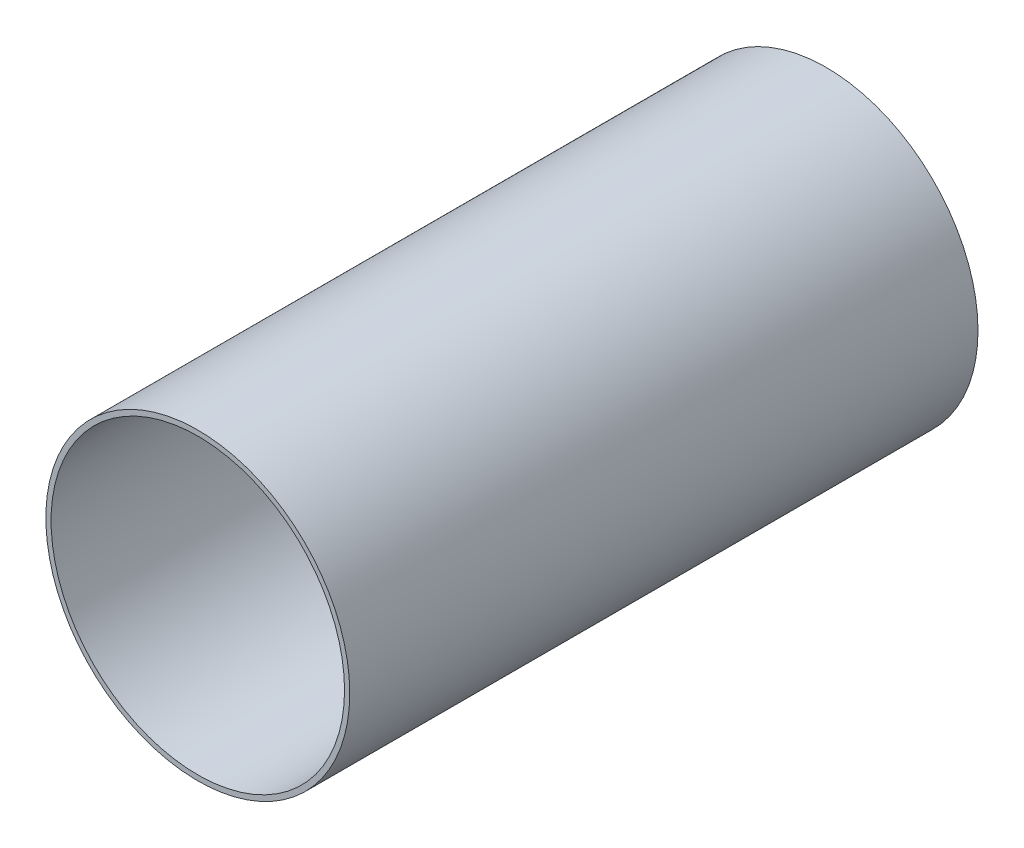
ISO-10303-21;
HEADER;
FILE_DESCRIPTION(('STEP AP214'),'2;1');
FILE_NAME('part.step','',(''),(''),'','','');
FILE_SCHEMA(('AUTOMOTIVE_DESIGN { 1 0 10303 214 1 1 1 1 }'));
ENDSEC;
DATA;
#1=APPLICATION_CONTEXT('core data for automotive mechanical design processes');
#2=APPLICATION_PROTOCOL_DEFINITION('international standard','automotive_design',2000,#1);
#3=PRODUCT_CONTEXT('',#1,'mechanical');
#4=PRODUCT('Part','Part','',(#3));
#5=PRODUCT_RELATED_PRODUCT_CATEGORY('part','',(#4));
#6=PRODUCT_DEFINITION_FORMATION('','',#4);
#7=PRODUCT_DEFINITION_CONTEXT('part definition',#1,'design');
#8=PRODUCT_DEFINITION('design','',#6,#7);
#9=PRODUCT_DEFINITION_SHAPE('','',#8);
#10=(LENGTH_UNIT() NAMED_UNIT(*) SI_UNIT(.MILLI.,.METRE.));
#11=(NAMED_UNIT(*) PLANE_ANGLE_UNIT() SI_UNIT($,.RADIAN.));
#12=(NAMED_UNIT(*) SI_UNIT($,.STERADIAN.) SOLID_ANGLE_UNIT());
#13=UNCERTAINTY_MEASURE_WITH_UNIT(LENGTH_MEASURE(1.E-05),#10,'distance_accuracy_value','');
#14=(GEOMETRIC_REPRESENTATION_CONTEXT(3) GLOBAL_UNCERTAINTY_ASSIGNED_CONTEXT((#13)) GLOBAL_UNIT_ASSIGNED_CONTEXT((#10,
#11,#12)) REPRESENTATION_CONTEXT('',''));
#15=CARTESIAN_POINT('',(0.,0.,0.));
#16=DIRECTION('',(0.,0.,1.));
#17=DIRECTION('',(1.,0.,0.));
#18=AXIS2_PLACEMENT_3D('',#15,#16,#17);
#19=CARTESIAN_POINT('',(0.,0.,326.63));
#20=DIRECTION('',(0.,0.,1.));
#21=DIRECTION('',(1.,0.,0.));
#22=AXIS2_PLACEMENT_3D('',#19,#20,#21);
#23=PLANE('',#22);
#24=CARTESIAN_POINT('',(0.,0.,326.63));
#25=DIRECTION('',(0.,0.,1.));
#26=DIRECTION('',(1.,0.,0.));
#27=AXIS2_PLACEMENT_3D('',#24,#25,#26);
#28=CIRCLE('',#27,79.);
#29=CARTESIAN_POINT('',(79.,0.,326.63));
#30=VERTEX_POINT('',#29);
#31=EDGE_CURVE('E10',#30,#30,#28,.T.);
#32=ORIENTED_EDGE('',*,*,#31,.T.);
#33=EDGE_LOOP('',(#32));
#34=FACE_BOUND('',#33,.T.);
#35=CARTESIAN_POINT('',(0.,0.,326.63));
#36=DIRECTION('',(0.,0.,1.));
#37=DIRECTION('',(1.,0.,0.));
#38=AXIS2_PLACEMENT_3D('',#35,#36,#37);
#39=CIRCLE('',#38,76.29);
#40=CARTESIAN_POINT('',(76.29,0.,326.63));
#41=VERTEX_POINT('',#40);
#42=EDGE_CURVE('E44',#41,#41,#39,.T.);
#43=ORIENTED_EDGE('',*,*,#42,.F.);
#44=EDGE_LOOP('',(#43));
#45=FACE_BOUND('',#44,.T.);
#46=ADVANCED_FACE('F33',(#34,#45),#23,.T.);
#47=CARTESIAN_POINT('',(0.,0.,0.));
#48=DIRECTION('',(0.,0.,1.));
#49=DIRECTION('',(1.,0.,0.));
#50=AXIS2_PLACEMENT_3D('',#47,#48,#49);
#51=PLANE('',#50);
#52=CARTESIAN_POINT('',(0.,0.,0.));
#53=DIRECTION('',(0.,0.,1.));
#54=DIRECTION('',(1.,0.,0.));
#55=AXIS2_PLACEMENT_3D('',#52,#53,#54);
#56=CIRCLE('',#55,79.);
#57=CARTESIAN_POINT('',(79.,0.,0.));
#58=VERTEX_POINT('',#57);
#59=EDGE_CURVE('E37',#58,#58,#56,.T.);
#60=ORIENTED_EDGE('',*,*,#59,.F.);
#61=EDGE_LOOP('',(#60));
#62=FACE_BOUND('',#61,.T.);
#63=CARTESIAN_POINT('',(0.,0.,0.));
#64=DIRECTION('',(0.,0.,1.));
#65=DIRECTION('',(1.,0.,0.));
#66=AXIS2_PLACEMENT_3D('',#63,#64,#65);
#67=CIRCLE('',#66,76.29);
#68=CARTESIAN_POINT('',(76.29,0.,0.));
#69=VERTEX_POINT('',#68);
#70=EDGE_CURVE('E46',#69,#69,#67,.T.);
#71=ORIENTED_EDGE('',*,*,#70,.T.);
#72=EDGE_LOOP('',(#71));
#73=FACE_BOUND('',#72,.T.);
#74=ADVANCED_FACE('F56',(#62,#73),#51,.F.);
#75=CARTESIAN_POINT('',(0.,0.,326.63));
#76=DIRECTION('',(0.,0.,-1.));
#77=DIRECTION('',(-1.,0.,0.));
#78=AXIS2_PLACEMENT_3D('',#75,#76,#77);
#79=CYLINDRICAL_SURFACE('',#78,79.);
#80=ORIENTED_EDGE('',*,*,#31,.F.);
#81=EDGE_LOOP('',(#80));
#82=FACE_BOUND('',#81,.T.);
#83=ORIENTED_EDGE('',*,*,#59,.T.);
#84=EDGE_LOOP('',(#83));
#85=FACE_BOUND('',#84,.T.);
#86=ADVANCED_FACE('F35',(#82,#85),#79,.T.);
#87=CARTESIAN_POINT('',(0.,0.,326.63));
#88=DIRECTION('',(0.,0.,-1.));
#89=DIRECTION('',(-1.,0.,0.));
#90=AXIS2_PLACEMENT_3D('',#87,#88,#89);
#91=CYLINDRICAL_SURFACE('',#90,76.29);
#92=ORIENTED_EDGE('',*,*,#42,.T.);
#93=EDGE_LOOP('',(#92));
#94=FACE_BOUND('',#93,.T.);
#95=ORIENTED_EDGE('',*,*,#70,.F.);
#96=EDGE_LOOP('',(#95));
#97=FACE_BOUND('',#96,.T.);
#98=ADVANCED_FACE('F52',(#94,#97),#91,.F.);
#99=CLOSED_SHELL('',(#46,#74,#86,#98));
#100=MANIFOLD_SOLID_BREP('B2',#99);
#101=ADVANCED_BREP_SHAPE_REPRESENTATION('',(#18,#100),#14);
#102=SHAPE_DEFINITION_REPRESENTATION(#9,#101);
ENDSEC;
END-ISO-10303-21;
